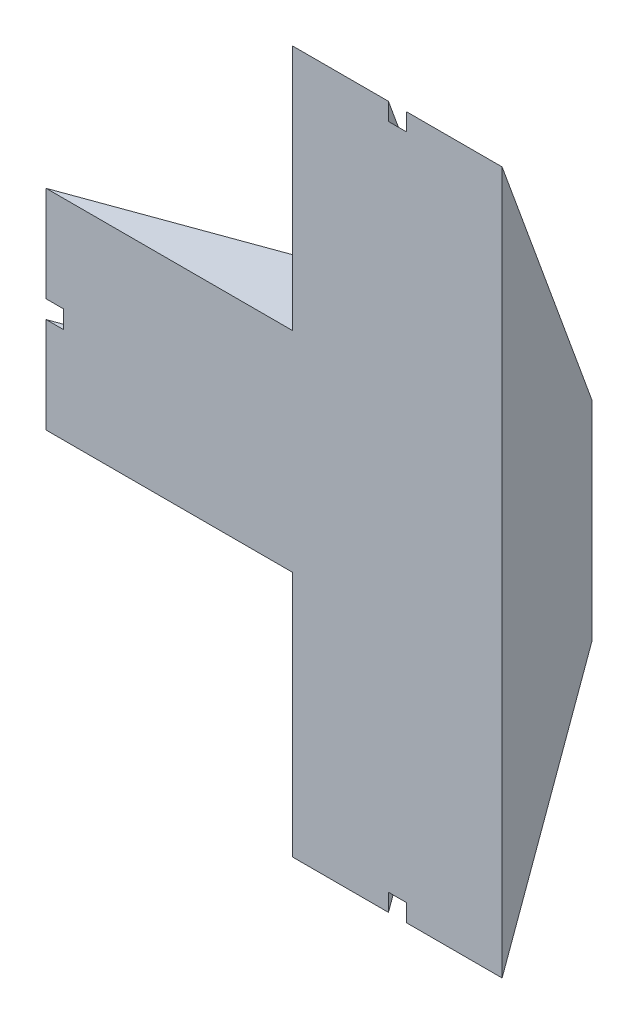
ISO-10303-21;
HEADER;
FILE_DESCRIPTION(('STEP AP214'),'2;1');
FILE_NAME('part.step','',(''),(''),'','','');
FILE_SCHEMA(('AUTOMOTIVE_DESIGN { 1 0 10303 214 1 1 1 1 }'));
ENDSEC;
DATA;
#1=APPLICATION_CONTEXT('core data for automotive mechanical design processes');
#2=APPLICATION_PROTOCOL_DEFINITION('international standard','automotive_design',2000,#1);
#3=PRODUCT_CONTEXT('',#1,'mechanical');
#4=PRODUCT('Part','Part','',(#3));
#5=PRODUCT_RELATED_PRODUCT_CATEGORY('part','',(#4));
#6=PRODUCT_DEFINITION_FORMATION('','',#4);
#7=PRODUCT_DEFINITION_CONTEXT('part definition',#1,'design');
#8=PRODUCT_DEFINITION('design','',#6,#7);
#9=PRODUCT_DEFINITION_SHAPE('','',#8);
#10=(LENGTH_UNIT() NAMED_UNIT(*) SI_UNIT(.MILLI.,.METRE.));
#11=(NAMED_UNIT(*) PLANE_ANGLE_UNIT() SI_UNIT($,.RADIAN.));
#12=(NAMED_UNIT(*) SI_UNIT($,.STERADIAN.) SOLID_ANGLE_UNIT());
#13=UNCERTAINTY_MEASURE_WITH_UNIT(LENGTH_MEASURE(1.E-05),#10,'distance_accuracy_value','');
#14=(GEOMETRIC_REPRESENTATION_CONTEXT(3) GLOBAL_UNCERTAINTY_ASSIGNED_CONTEXT((#13)) GLOBAL_UNIT_ASSIGNED_CONTEXT((#10,
#11,#12)) REPRESENTATION_CONTEXT('',''));
#15=CARTESIAN_POINT('',(0.,0.,0.));
#16=DIRECTION('',(0.,0.,1.));
#17=DIRECTION('',(1.,0.,0.));
#18=AXIS2_PLACEMENT_3D('',#15,#16,#17);
#19=CARTESIAN_POINT('',(412.121612918201,89.1512931806673,-244.941164929067));
#20=DIRECTION('',(0.,-0.342020143325663,0.93969262078591));
#21=DIRECTION('',(0.,-0.939692620785911,-0.342020143325663));
#22=AXIS2_PLACEMENT_3D('',#19,#20,#21);
#23=PLANE('',#22);
#24=DIRECTION('',(-1.,0.,0.));
#25=VECTOR('',#24,1.);
#26=CARTESIAN_POINT('',(762.121612918201,350.,-150.));
#27=LINE('',#26,#25);
#28=CARTESIAN_POINT('',(762.121612918201,350.,-150.));
#29=VERTEX_POINT('',#28);
#30=CARTESIAN_POINT('',(602.121612918201,350.,-150.));
#31=VERTEX_POINT('',#30);
#32=EDGE_CURVE('E210',#29,#31,#27,.T.);
#33=ORIENTED_EDGE('',*,*,#32,.T.);
#34=DIRECTION('',(0.,-0.93969262078591,-0.342020143325663));
#35=VECTOR('',#34,1.);
#36=CARTESIAN_POINT('',(602.121612918201,350.,-150.));
#37=LINE('',#36,#35);
#38=CARTESIAN_POINT('',(602.121612918201,762.121612918201,0.));
#39=VERTEX_POINT('',#38);
#40=EDGE_CURVE('E192',#39,#31,#37,.T.);
#41=ORIENTED_EDGE('',*,*,#40,.F.);
#42=DIRECTION('',(1.,0.,0.));
#43=VECTOR('',#42,1.);
#44=CARTESIAN_POINT('',(412.121612918201,762.121612918201,0.));
#45=LINE('',#44,#43);
#46=CARTESIAN_POINT('',(762.121612918201,762.121612918201,0.));
#47=VERTEX_POINT('',#46);
#48=EDGE_CURVE('E279',#39,#47,#45,.T.);
#49=ORIENTED_EDGE('',*,*,#48,.T.);
#50=DIRECTION('',(0.,-0.939692620785911,-0.342020143325663));
#51=VECTOR('',#50,1.);
#52=CARTESIAN_POINT('',(762.121612918201,89.1512931806673,-244.941164929067));
#53=LINE('',#52,#51);
#54=EDGE_CURVE('E271',#47,#29,#53,.T.);
#55=ORIENTED_EDGE('',*,*,#54,.T.);
#56=EDGE_LOOP('',(#33,#41,#49,#55));
#57=FACE_BOUND('',#56,.T.);
#58=ADVANCED_FACE('F35',(#57),#23,.F.);
#59=CARTESIAN_POINT('',(0.,0.,-140.));
#60=DIRECTION('',(0.,0.,-1.));
#61=DIRECTION('',(-1.,0.,0.));
#62=AXIS2_PLACEMENT_3D('',#59,#60,#61);
#63=PLANE('',#62);
#64=DIRECTION('',(0.,1.,0.));
#65=VECTOR('',#64,1.);
#66=CARTESIAN_POINT('',(572.121612918201,190.,-140.));
#67=LINE('',#66,#65);
#68=CARTESIAN_POINT('',(572.121612918201,190.,-140.));
#69=VERTEX_POINT('',#68);
#70=CARTESIAN_POINT('',(572.121612918201,348.236730192916,-140.));
#71=VERTEX_POINT('',#70);
#72=EDGE_CURVE('E329',#69,#71,#67,.T.);
#73=ORIENTED_EDGE('',*,*,#72,.T.);
#74=DIRECTION('',(1.,0.,0.));
#75=VECTOR('',#74,1.);
#76=CARTESIAN_POINT('',(0.,348.236730192916,-140.));
#77=LINE('',#76,#75);
#78=CARTESIAN_POINT('',(602.121612918201,348.236730192916,-140.));
#79=VERTEX_POINT('',#78);
#80=EDGE_CURVE('E394',#71,#79,#77,.T.);
#81=ORIENTED_EDGE('',*,*,#80,.T.);
#82=DIRECTION('',(0.,-1.,0.));
#83=VECTOR('',#82,1.);
#84=CARTESIAN_POINT('',(602.121612918201,190.,-140.));
#85=LINE('',#84,#83);
#86=CARTESIAN_POINT('',(602.121612918201,1.76326980708429,-140.));
#87=VERTEX_POINT('',#86);
#88=EDGE_CURVE('E333',#79,#87,#85,.T.);
#89=ORIENTED_EDGE('',*,*,#88,.T.);
#90=DIRECTION('',(1.,0.,0.));
#91=VECTOR('',#90,1.);
#92=CARTESIAN_POINT('',(0.,1.76326980708428,-140.));
#93=LINE('',#92,#91);
#94=CARTESIAN_POINT('',(572.121612918201,1.76326980708429,-140.));
#95=VERTEX_POINT('',#94);
#96=EDGE_CURVE('E313',#95,#87,#93,.T.);
#97=ORIENTED_EDGE('',*,*,#96,.F.);
#98=DIRECTION('',(0.,1.,0.));
#99=VECTOR('',#98,1.);
#100=CARTESIAN_POINT('',(572.121612918201,160.,-140.));
#101=LINE('',#100,#99);
#102=CARTESIAN_POINT('',(572.121612918201,160.,-140.));
#103=VERTEX_POINT('',#102);
#104=EDGE_CURVE('E335',#95,#103,#101,.T.);
#105=ORIENTED_EDGE('',*,*,#104,.T.);
#106=DIRECTION('',(-1.,0.,0.));
#107=VECTOR('',#106,1.);
#108=CARTESIAN_POINT('',(412.121612918201,160.,-140.));
#109=LINE('',#108,#107);
#110=CARTESIAN_POINT('',(413.884882725286,160.,-140.));
#111=VERTEX_POINT('',#110);
#112=EDGE_CURVE('E337',#103,#111,#109,.T.);
#113=ORIENTED_EDGE('',*,*,#112,.T.);
#114=DIRECTION('',(0.,1.,0.));
#115=VECTOR('',#114,1.);
#116=CARTESIAN_POINT('',(413.884882725286,0.,-140.));
#117=LINE('',#116,#115);
#118=CARTESIAN_POINT('',(413.884882725286,190.,-140.));
#119=VERTEX_POINT('',#118);
#120=EDGE_CURVE('E246',#111,#119,#117,.T.);
#121=ORIENTED_EDGE('',*,*,#120,.T.);
#122=DIRECTION('',(1.,0.,0.));
#123=VECTOR('',#122,1.);
#124=CARTESIAN_POINT('',(412.121612918201,190.,-140.));
#125=LINE('',#124,#123);
#126=EDGE_CURVE('E327',#119,#69,#125,.T.);
#127=ORIENTED_EDGE('',*,*,#126,.T.);
#128=EDGE_LOOP('',(#73,#81,#89,#97,#105,#113,#121,#127));
#129=FACE_BOUND('',#128,.T.);
#130=ADVANCED_FACE('F380',(#129),#63,.T.);
#131=CARTESIAN_POINT('',(412.121612918201,-412.121612918201,0.));
#132=DIRECTION('',(0.,-0.342020143325663,-0.939692620785911));
#133=DIRECTION('',(0.,0.939692620785911,-0.342020143325663));
#134=AXIS2_PLACEMENT_3D('',#131,#132,#133);
#135=PLANE('',#134);
#136=DIRECTION('',(0.,0.939692620785911,-0.342020143325663));
#137=VECTOR('',#136,1.);
#138=CARTESIAN_POINT('',(572.121612918201,0.,-150.));
#139=LINE('',#138,#137);
#140=CARTESIAN_POINT('',(572.121612918201,-412.121612918201,0.));
#141=VERTEX_POINT('',#140);
#142=CARTESIAN_POINT('',(572.121612918201,0.,-150.));
#143=VERTEX_POINT('',#142);
#144=EDGE_CURVE('E304',#141,#143,#139,.T.);
#145=ORIENTED_EDGE('',*,*,#144,.F.);
#146=DIRECTION('',(1.,0.,0.));
#147=VECTOR('',#146,1.);
#148=CARTESIAN_POINT('',(412.121612918201,-412.121612918201,0.));
#149=LINE('',#148,#147);
#150=CARTESIAN_POINT('',(412.121612918201,-412.121612918201,0.));
#151=VERTEX_POINT('',#150);
#152=EDGE_CURVE('E268',#151,#141,#149,.T.);
#153=ORIENTED_EDGE('',*,*,#152,.F.);
#154=DIRECTION('',(0.,0.939692620785911,-0.342020143325663));
#155=VECTOR('',#154,1.);
#156=CARTESIAN_POINT('',(412.121612918201,-412.121612918201,0.));
#157=LINE('',#156,#155);
#158=CARTESIAN_POINT('',(412.121612918201,0.,-150.));
#159=VERTEX_POINT('',#158);
#160=EDGE_CURVE('E263',#151,#159,#157,.T.);
#161=ORIENTED_EDGE('',*,*,#160,.T.);
#162=DIRECTION('',(-1.,0.,0.));
#163=VECTOR('',#162,1.);
#164=CARTESIAN_POINT('',(762.121612918201,0.,-150.));
#165=LINE('',#164,#163);
#166=EDGE_CURVE('E213',#143,#159,#165,.T.);
#167=ORIENTED_EDGE('',*,*,#166,.F.);
#168=EDGE_LOOP('',(#145,#153,#161,#167));
#169=FACE_BOUND('',#168,.T.);
#170=ADVANCED_FACE('F368',(#169),#135,.T.);
#171=CARTESIAN_POINT('',(762.121612918201,0.,-150.));
#172=DIRECTION('',(0.,0.,1.));
#173=DIRECTION('',(1.,0.,0.));
#174=AXIS2_PLACEMENT_3D('',#171,#172,#173);
#175=PLANE('',#174);
#176=DIRECTION('',(0.,-1.,0.));
#177=VECTOR('',#176,1.);
#178=CARTESIAN_POINT('',(412.121612918201,350.,-150.));
#179=LINE('',#178,#177);
#180=CARTESIAN_POINT('',(412.121612918201,160.,-150.));
#181=VERTEX_POINT('',#180);
#182=EDGE_CURVE('E228',#181,#159,#179,.T.);
#183=ORIENTED_EDGE('',*,*,#182,.F.);
#184=DIRECTION('',(-1.,0.,0.));
#185=VECTOR('',#184,1.);
#186=CARTESIAN_POINT('',(412.121612918201,160.,-150.));
#187=LINE('',#186,#185);
#188=CARTESIAN_POINT('',(572.121612918201,160.,-150.));
#189=VERTEX_POINT('',#188);
#190=EDGE_CURVE('E330',#189,#181,#187,.T.);
#191=ORIENTED_EDGE('',*,*,#190,.F.);
#192=DIRECTION('',(0.,1.,0.));
#193=VECTOR('',#192,1.);
#194=CARTESIAN_POINT('',(572.121612918201,160.,-150.));
#195=LINE('',#194,#193);
#196=EDGE_CURVE('E341',#143,#189,#195,.T.);
#197=ORIENTED_EDGE('',*,*,#196,.F.);
#198=ORIENTED_EDGE('',*,*,#166,.T.);
#199=EDGE_LOOP('',(#183,#191,#197,#198));
#200=FACE_BOUND('',#199,.T.);
#201=ADVANCED_FACE('F377',(#200),#175,.F.);
#202=CARTESIAN_POINT('',(762.121612918201,0.,-150.));
#203=VERTEX_POINT('',#202);
#204=CARTESIAN_POINT('',(602.121612918201,0.,-150.));
#205=VERTEX_POINT('',#204);
#206=EDGE_CURVE('E218',#203,#205,#165,.T.);
#207=ORIENTED_EDGE('',*,*,#206,.T.);
#208=DIRECTION('',(0.,-1.,0.));
#209=VECTOR('',#208,1.);
#210=CARTESIAN_POINT('',(602.121612918201,160.,-150.));
#211=LINE('',#210,#209);
#212=EDGE_CURVE('E202',#31,#205,#211,.T.);
#213=ORIENTED_EDGE('',*,*,#212,.F.);
#214=ORIENTED_EDGE('',*,*,#32,.F.);
#215=DIRECTION('',(0.,1.,0.));
#216=VECTOR('',#215,1.);
#217=CARTESIAN_POINT('',(762.121612918201,0.,-150.));
#218=LINE('',#217,#216);
#219=EDGE_CURVE('E79',#203,#29,#218,.T.);
#220=ORIENTED_EDGE('',*,*,#219,.F.);
#221=EDGE_LOOP('',(#207,#213,#214,#220));
#222=FACE_BOUND('',#221,.T.);
#223=ADVANCED_FACE('F293',(#222),#175,.F.);
#224=CARTESIAN_POINT('',(3.42020143325663,0.,9.3969262078591));
#225=DIRECTION('',(0.342020143325663,0.,0.93969262078591));
#226=DIRECTION('',(0.93969262078591,0.,-0.342020143325663));
#227=AXIS2_PLACEMENT_3D('',#224,#225,#226);
#228=PLANE('',#227);
#229=ORIENTED_EDGE('',*,*,#120,.F.);
#230=DIRECTION('',(-0.93969262078591,0.,0.342020143325663));
#231=VECTOR('',#230,1.);
#232=CARTESIAN_POINT('',(3.42020143325661,160.,9.39692620785911));
#233=LINE('',#232,#231);
#234=CARTESIAN_POINT('',(29.2380440016314,160.,0.));
#235=VERTEX_POINT('',#234);
#236=EDGE_CURVE('E253',#111,#235,#233,.T.);
#237=ORIENTED_EDGE('',*,*,#236,.T.);
#238=DIRECTION('',(0.,-1.,0.));
#239=VECTOR('',#238,1.);
#240=CARTESIAN_POINT('',(29.2380440016314,350.,0.));
#241=LINE('',#240,#239);
#242=CARTESIAN_POINT('',(29.2380440016314,190.,0.));
#243=VERTEX_POINT('',#242);
#244=EDGE_CURVE('E11',#243,#235,#241,.T.);
#245=ORIENTED_EDGE('',*,*,#244,.F.);
#246=DIRECTION('',(0.93969262078591,0.,-0.342020143325663));
#247=VECTOR('',#246,1.);
#248=CARTESIAN_POINT('',(3.42020143325661,190.,9.39692620785911));
#249=LINE('',#248,#247);
#250=EDGE_CURVE('E248',#243,#119,#249,.T.);
#251=ORIENTED_EDGE('',*,*,#250,.T.);
#252=EDGE_LOOP('',(#229,#237,#245,#251));
#253=FACE_BOUND('',#252,.T.);
#254=ADVANCED_FACE('F352',(#253),#228,.F.);
#255=CARTESIAN_POINT('',(412.121612918201,350.,-150.));
#256=DIRECTION('',(0.342020143325663,0.,0.93969262078591));
#257=DIRECTION('',(0.93969262078591,0.,-0.342020143325663));
#258=AXIS2_PLACEMENT_3D('',#255,#256,#257);
#259=PLANE('',#258);
#260=DIRECTION('',(0.,-1.,0.));
#261=VECTOR('',#260,1.);
#262=CARTESIAN_POINT('',(0.,350.,0.));
#263=LINE('',#262,#261);
#264=CARTESIAN_POINT('',(0.,160.,0.));
#265=VERTEX_POINT('',#264);
#266=CARTESIAN_POINT('',(0.,0.,0.));
#267=VERTEX_POINT('',#266);
#268=EDGE_CURVE('E71',#265,#267,#263,.T.);
#269=ORIENTED_EDGE('',*,*,#268,.F.);
#270=DIRECTION('',(-0.93969262078591,0.,0.342020143325663));
#271=VECTOR('',#270,1.);
#272=CARTESIAN_POINT('',(0.,160.,0.));
#273=LINE('',#272,#271);
#274=EDGE_CURVE('E245',#181,#265,#273,.T.);
#275=ORIENTED_EDGE('',*,*,#274,.F.);
#276=ORIENTED_EDGE('',*,*,#182,.T.);
#277=DIRECTION('',(-0.93969262078591,0.,0.342020143325663));
#278=VECTOR('',#277,1.);
#279=CARTESIAN_POINT('',(412.121612918201,0.,-150.));
#280=LINE('',#279,#278);
#281=EDGE_CURVE('E221',#159,#267,#280,.T.);
#282=ORIENTED_EDGE('',*,*,#281,.T.);
#283=EDGE_LOOP('',(#269,#275,#276,#282));
#284=FACE_BOUND('',#283,.T.);
#285=ADVANCED_FACE('F358',(#284),#259,.F.);
#286=CARTESIAN_POINT('',(0.,0.,0.));
#287=DIRECTION('',(0.,-1.,0.));
#288=DIRECTION('',(0.,0.,-1.));
#289=AXIS2_PLACEMENT_3D('',#286,#287,#288);
#290=PLANE('',#289);
#291=ORIENTED_EDGE('',*,*,#281,.F.);
#292=DIRECTION('',(0.,0.,1.));
#293=VECTOR('',#292,1.);
#294=CARTESIAN_POINT('',(412.121612918201,0.,0.));
#295=LINE('',#294,#293);
#296=CARTESIAN_POINT('',(412.121612918201,0.,0.));
#297=VERTEX_POINT('',#296);
#298=EDGE_CURVE('E260',#159,#297,#295,.T.);
#299=ORIENTED_EDGE('',*,*,#298,.T.);
#300=DIRECTION('',(1.,0.,0.));
#301=VECTOR('',#300,1.);
#302=CARTESIAN_POINT('',(0.,0.,0.));
#303=LINE('',#302,#301);
#304=EDGE_CURVE('E226',#267,#297,#303,.T.);
#305=ORIENTED_EDGE('',*,*,#304,.F.);
#306=EDGE_LOOP('',(#291,#299,#305));
#307=FACE_BOUND('',#306,.T.);
#308=ADVANCED_FACE('F363',(#307),#290,.T.);
#309=CARTESIAN_POINT('',(0.,350.,0.));
#310=DIRECTION('',(0.,-1.,0.));
#311=DIRECTION('',(0.,0.,-1.));
#312=AXIS2_PLACEMENT_3D('',#309,#310,#311);
#313=PLANE('',#312);
#314=DIRECTION('',(0.,0.,1.));
#315=VECTOR('',#314,1.);
#316=CARTESIAN_POINT('',(412.121612918201,350.,0.));
#317=LINE('',#316,#315);
#318=CARTESIAN_POINT('',(412.121612918201,350.,-150.));
#319=VERTEX_POINT('',#318);
#320=CARTESIAN_POINT('',(412.121612918201,350.,0.));
#321=VERTEX_POINT('',#320);
#322=EDGE_CURVE('E276',#319,#321,#317,.T.);
#323=ORIENTED_EDGE('',*,*,#322,.F.);
#324=DIRECTION('',(-0.93969262078591,0.,0.342020143325663));
#325=VECTOR('',#324,1.);
#326=CARTESIAN_POINT('',(412.121612918201,350.,-150.));
#327=LINE('',#326,#325);
#328=CARTESIAN_POINT('',(0.,350.,0.));
#329=VERTEX_POINT('',#328);
#330=EDGE_CURVE('E222',#319,#329,#327,.T.);
#331=ORIENTED_EDGE('',*,*,#330,.T.);
#332=DIRECTION('',(1.,0.,0.));
#333=VECTOR('',#332,1.);
#334=CARTESIAN_POINT('',(0.,350.,0.));
#335=LINE('',#334,#333);
#336=EDGE_CURVE('E225',#329,#321,#335,.T.);
#337=ORIENTED_EDGE('',*,*,#336,.T.);
#338=EDGE_LOOP('',(#323,#331,#337));
#339=FACE_BOUND('',#338,.T.);
#340=ADVANCED_FACE('F429',(#339),#313,.F.);
#341=CARTESIAN_POINT('',(412.121612918201,190.,-150.));
#342=VERTEX_POINT('',#341);
#343=EDGE_CURVE('E208',#319,#342,#179,.T.);
#344=ORIENTED_EDGE('',*,*,#343,.T.);
#345=DIRECTION('',(0.93969262078591,0.,-0.342020143325663));
#346=VECTOR('',#345,1.);
#347=CARTESIAN_POINT('',(0.,190.,0.));
#348=LINE('',#347,#346);
#349=CARTESIAN_POINT('',(0.,190.,0.));
#350=VERTEX_POINT('',#349);
#351=EDGE_CURVE('E243',#350,#342,#348,.T.);
#352=ORIENTED_EDGE('',*,*,#351,.F.);
#353=EDGE_CURVE('E43',#329,#350,#263,.T.);
#354=ORIENTED_EDGE('',*,*,#353,.F.);
#355=ORIENTED_EDGE('',*,*,#330,.F.);
#356=EDGE_LOOP('',(#344,#352,#354,#355));
#357=FACE_BOUND('',#356,.T.);
#358=ADVANCED_FACE('F37',(#357),#259,.F.);
#359=CARTESIAN_POINT('',(0.,350.,0.));
#360=DIRECTION('',(0.,0.,-1.));
#361=DIRECTION('',(-1.,0.,0.));
#362=AXIS2_PLACEMENT_3D('',#359,#360,#361);
#363=PLANE('',#362);
#364=ORIENTED_EDGE('',*,*,#48,.F.);
#365=DIRECTION('',(0.,-1.,0.));
#366=VECTOR('',#365,1.);
#367=CARTESIAN_POINT('',(602.121612918201,350.,0.));
#368=LINE('',#367,#366);
#369=CARTESIAN_POINT('',(602.121612918201,732.88356891657,0.));
#370=VERTEX_POINT('',#369);
#371=EDGE_CURVE('E298',#39,#370,#368,.T.);
#372=ORIENTED_EDGE('',*,*,#371,.T.);
#373=DIRECTION('',(1.,0.,0.));
#374=VECTOR('',#373,1.);
#375=CARTESIAN_POINT('',(0.,732.88356891657,0.));
#376=LINE('',#375,#374);
#377=CARTESIAN_POINT('',(572.121612918201,732.88356891657,0.));
#378=VERTEX_POINT('',#377);
#379=EDGE_CURVE('E299',#378,#370,#376,.T.);
#380=ORIENTED_EDGE('',*,*,#379,.F.);
#381=DIRECTION('',(0.,1.,0.));
#382=VECTOR('',#381,1.);
#383=CARTESIAN_POINT('',(572.121612918201,350.,0.));
#384=LINE('',#383,#382);
#385=CARTESIAN_POINT('',(572.121612918201,762.121612918201,0.));
#386=VERTEX_POINT('',#385);
#387=EDGE_CURVE('E302',#378,#386,#384,.T.);
#388=ORIENTED_EDGE('',*,*,#387,.T.);
#389=CARTESIAN_POINT('',(412.121612918201,762.121612918201,0.));
#390=VERTEX_POINT('',#389);
#391=EDGE_CURVE('E189',#390,#386,#45,.T.);
#392=ORIENTED_EDGE('',*,*,#391,.F.);
#393=DIRECTION('',(0.,1.,0.));
#394=VECTOR('',#393,1.);
#395=CARTESIAN_POINT('',(412.121612918201,0.,0.));
#396=LINE('',#395,#394);
#397=EDGE_CURVE('E274',#321,#390,#396,.T.);
#398=ORIENTED_EDGE('',*,*,#397,.F.);
#399=ORIENTED_EDGE('',*,*,#336,.F.);
#400=ORIENTED_EDGE('',*,*,#353,.T.);
#401=DIRECTION('',(1.,0.,0.));
#402=VECTOR('',#401,1.);
#403=CARTESIAN_POINT('',(0.,190.,0.));
#404=LINE('',#403,#402);
#405=EDGE_CURVE('E237',#350,#243,#404,.T.);
#406=ORIENTED_EDGE('',*,*,#405,.T.);
#407=ORIENTED_EDGE('',*,*,#244,.T.);
#408=DIRECTION('',(-1.,0.,0.));
#409=VECTOR('',#408,1.);
#410=CARTESIAN_POINT('',(0.,160.,0.));
#411=LINE('',#410,#409);
#412=EDGE_CURVE('E257',#235,#265,#411,.T.);
#413=ORIENTED_EDGE('',*,*,#412,.T.);
#414=ORIENTED_EDGE('',*,*,#268,.T.);
#415=ORIENTED_EDGE('',*,*,#304,.T.);
#416=DIRECTION('',(0.,-1.,0.));
#417=VECTOR('',#416,1.);
#418=CARTESIAN_POINT('',(412.121612918201,0.,0.));
#419=LINE('',#418,#417);
#420=EDGE_CURVE('E50',#297,#151,#419,.T.);
#421=ORIENTED_EDGE('',*,*,#420,.T.);
#422=ORIENTED_EDGE('',*,*,#152,.T.);
#423=DIRECTION('',(0.,1.,0.));
#424=VECTOR('',#423,1.);
#425=CARTESIAN_POINT('',(572.121612918201,350.,0.));
#426=LINE('',#425,#424);
#427=CARTESIAN_POINT('',(572.121612918201,-382.88356891657,0.));
#428=VERTEX_POINT('',#427);
#429=EDGE_CURVE('E324',#141,#428,#426,.T.);
#430=ORIENTED_EDGE('',*,*,#429,.T.);
#431=DIRECTION('',(1.,0.,0.));
#432=VECTOR('',#431,1.);
#433=CARTESIAN_POINT('',(0.,-382.88356891657,0.));
#434=LINE('',#433,#432);
#435=CARTESIAN_POINT('',(602.121612918201,-382.88356891657,0.));
#436=VERTEX_POINT('',#435);
#437=EDGE_CURVE('E318',#428,#436,#434,.T.);
#438=ORIENTED_EDGE('',*,*,#437,.T.);
#439=DIRECTION('',(0.,-1.,0.));
#440=VECTOR('',#439,1.);
#441=CARTESIAN_POINT('',(602.121612918201,350.,0.));
#442=LINE('',#441,#440);
#443=CARTESIAN_POINT('',(602.121612918201,-412.121612918201,0.));
#444=VERTEX_POINT('',#443);
#445=EDGE_CURVE('E321',#436,#444,#442,.T.);
#446=ORIENTED_EDGE('',*,*,#445,.T.);
#447=CARTESIAN_POINT('',(762.121612918201,-412.121612918201,0.));
#448=VERTEX_POINT('',#447);
#449=EDGE_CURVE('E266',#444,#448,#149,.T.);
#450=ORIENTED_EDGE('',*,*,#449,.T.);
#451=DIRECTION('',(0.,-1.,0.));
#452=VECTOR('',#451,1.);
#453=CARTESIAN_POINT('',(762.121612918201,350.,0.));
#454=LINE('',#453,#452);
#455=EDGE_CURVE('E214',#47,#448,#454,.T.);
#456=ORIENTED_EDGE('',*,*,#455,.F.);
#457=EDGE_LOOP('',(#364,#372,#380,#388,#392,#398,#399,#400,#406,#407,#413,#414,#415,#421,#422,
#430,#438,#446,#450,#456));
#458=FACE_BOUND('',#457,.T.);
#459=ADVANCED_FACE('F236',(#458),#363,.F.);
#460=CARTESIAN_POINT('',(572.121612918201,350.,-150.));
#461=VERTEX_POINT('',#460);
#462=EDGE_CURVE('E59',#461,#319,#27,.T.);
#463=ORIENTED_EDGE('',*,*,#462,.F.);
#464=DIRECTION('',(0.,1.,0.));
#465=VECTOR('',#464,1.);
#466=CARTESIAN_POINT('',(572.121612918201,190.,-150.));
#467=LINE('',#466,#465);
#468=CARTESIAN_POINT('',(572.121612918201,190.,-150.));
#469=VERTEX_POINT('',#468);
#470=EDGE_CURVE('E195',#469,#461,#467,.T.);
#471=ORIENTED_EDGE('',*,*,#470,.F.);
#472=DIRECTION('',(1.,0.,0.));
#473=VECTOR('',#472,1.);
#474=CARTESIAN_POINT('',(412.121612918201,190.,-150.));
#475=LINE('',#474,#473);
#476=EDGE_CURVE('E203',#342,#469,#475,.T.);
#477=ORIENTED_EDGE('',*,*,#476,.F.);
#478=ORIENTED_EDGE('',*,*,#343,.F.);
#479=EDGE_LOOP('',(#463,#471,#477,#478));
#480=FACE_BOUND('',#479,.T.);
#481=ADVANCED_FACE('F206',(#480),#175,.F.);
#482=CARTESIAN_POINT('',(762.121612918201,0.,0.));
#483=DIRECTION('',(1.,0.,0.));
#484=DIRECTION('',(0.,0.,-1.));
#485=AXIS2_PLACEMENT_3D('',#482,#483,#484);
#486=PLANE('',#485);
#487=ORIENTED_EDGE('',*,*,#455,.T.);
#488=DIRECTION('',(0.,0.939692620785911,-0.342020143325663));
#489=VECTOR('',#488,1.);
#490=CARTESIAN_POINT('',(762.121612918201,-412.121612918201,0.));
#491=LINE('',#490,#489);
#492=EDGE_CURVE('E259',#448,#203,#491,.T.);
#493=ORIENTED_EDGE('',*,*,#492,.T.);
#494=ORIENTED_EDGE('',*,*,#219,.T.);
#495=ORIENTED_EDGE('',*,*,#54,.F.);
#496=EDGE_LOOP('',(#487,#493,#494,#495));
#497=FACE_BOUND('',#496,.T.);
#498=ADVANCED_FACE('F285',(#497),#486,.T.);
#499=ORIENTED_EDGE('',*,*,#391,.T.);
#500=DIRECTION('',(0.,0.93969262078591,0.342020143325663));
#501=VECTOR('',#500,1.);
#502=CARTESIAN_POINT('',(572.121612918201,350.,-150.));
#503=LINE('',#502,#501);
#504=EDGE_CURVE('E185',#461,#386,#503,.T.);
#505=ORIENTED_EDGE('',*,*,#504,.F.);
#506=ORIENTED_EDGE('',*,*,#462,.T.);
#507=DIRECTION('',(0.,-0.939692620785911,-0.342020143325663));
#508=VECTOR('',#507,1.);
#509=CARTESIAN_POINT('',(412.121612918201,89.1512931806673,-244.941164929067));
#510=LINE('',#509,#508);
#511=EDGE_CURVE('E272',#390,#319,#510,.T.);
#512=ORIENTED_EDGE('',*,*,#511,.F.);
#513=EDGE_LOOP('',(#499,#505,#506,#512));
#514=FACE_BOUND('',#513,.T.);
#515=ADVANCED_FACE('F187',(#514),#23,.F.);
#516=CARTESIAN_POINT('',(412.121612918201,0.,0.));
#517=DIRECTION('',(1.,0.,0.));
#518=DIRECTION('',(0.,0.,-1.));
#519=AXIS2_PLACEMENT_3D('',#516,#517,#518);
#520=PLANE('',#519);
#521=ORIENTED_EDGE('',*,*,#511,.T.);
#522=ORIENTED_EDGE('',*,*,#322,.T.);
#523=ORIENTED_EDGE('',*,*,#397,.T.);
#524=EDGE_LOOP('',(#521,#522,#523));
#525=FACE_BOUND('',#524,.T.);
#526=ADVANCED_FACE('F418',(#525),#520,.F.);
#527=DIRECTION('',(0.,-0.939692620785911,0.342020143325663));
#528=VECTOR('',#527,1.);
#529=CARTESIAN_POINT('',(602.121612918201,0.,-150.));
#530=LINE('',#529,#528);
#531=EDGE_CURVE('E289',#205,#444,#530,.T.);
#532=ORIENTED_EDGE('',*,*,#531,.F.);
#533=ORIENTED_EDGE('',*,*,#206,.F.);
#534=ORIENTED_EDGE('',*,*,#492,.F.);
#535=ORIENTED_EDGE('',*,*,#449,.F.);
#536=EDGE_LOOP('',(#532,#533,#534,#535));
#537=FACE_BOUND('',#536,.T.);
#538=ADVANCED_FACE('F288',(#537),#135,.T.);
#539=CARTESIAN_POINT('',(412.121612918201,0.,0.));
#540=DIRECTION('',(-1.,0.,0.));
#541=DIRECTION('',(0.,0.,1.));
#542=AXIS2_PLACEMENT_3D('',#539,#540,#541);
#543=PLANE('',#542);
#544=ORIENTED_EDGE('',*,*,#298,.F.);
#545=ORIENTED_EDGE('',*,*,#160,.F.);
#546=ORIENTED_EDGE('',*,*,#420,.F.);
#547=EDGE_LOOP('',(#544,#545,#546));
#548=FACE_BOUND('',#547,.T.);
#549=ADVANCED_FACE('F364',(#548),#543,.T.);
#550=CARTESIAN_POINT('',(3.42020143325661,160.,9.39692620785911));
#551=DIRECTION('',(0.,-1.,0.));
#552=DIRECTION('',(1.,0.,0.));
#553=AXIS2_PLACEMENT_3D('',#550,#551,#552);
#554=PLANE('',#553);
#555=ORIENTED_EDGE('',*,*,#236,.F.);
#556=ORIENTED_EDGE('',*,*,#112,.F.);
#557=DIRECTION('',(0.,0.,-1.));
#558=VECTOR('',#557,1.);
#559=CARTESIAN_POINT('',(572.121612918201,160.,-140.));
#560=LINE('',#559,#558);
#561=EDGE_CURVE('E250',#103,#189,#560,.T.);
#562=ORIENTED_EDGE('',*,*,#561,.T.);
#563=ORIENTED_EDGE('',*,*,#190,.T.);
#564=ORIENTED_EDGE('',*,*,#274,.T.);
#565=ORIENTED_EDGE('',*,*,#412,.F.);
#566=EDGE_LOOP('',(#555,#556,#562,#563,#564,#565));
#567=FACE_BOUND('',#566,.T.);
#568=ADVANCED_FACE('F355',(#567),#554,.F.);
#569=CARTESIAN_POINT('',(3.42020143325661,190.,9.39692620785911));
#570=DIRECTION('',(0.,1.,0.));
#571=DIRECTION('',(-1.,0.,0.));
#572=AXIS2_PLACEMENT_3D('',#569,#570,#571);
#573=PLANE('',#572);
#574=ORIENTED_EDGE('',*,*,#126,.F.);
#575=ORIENTED_EDGE('',*,*,#250,.F.);
#576=ORIENTED_EDGE('',*,*,#405,.F.);
#577=ORIENTED_EDGE('',*,*,#351,.T.);
#578=ORIENTED_EDGE('',*,*,#476,.T.);
#579=DIRECTION('',(0.,0.,-1.));
#580=VECTOR('',#579,1.);
#581=CARTESIAN_POINT('',(572.121612918201,190.,-140.));
#582=LINE('',#581,#580);
#583=EDGE_CURVE('E199',#69,#469,#582,.T.);
#584=ORIENTED_EDGE('',*,*,#583,.F.);
#585=EDGE_LOOP('',(#574,#575,#576,#577,#578,#584));
#586=FACE_BOUND('',#585,.T.);
#587=ADVANCED_FACE('F399',(#586),#573,.F.);
#588=CARTESIAN_POINT('',(572.121612918201,160.,-140.));
#589=DIRECTION('',(-1.,0.,0.));
#590=DIRECTION('',(0.,0.,1.));
#591=AXIS2_PLACEMENT_3D('',#588,#589,#590);
#592=PLANE('',#591);
#593=ORIENTED_EDGE('',*,*,#104,.F.);
#594=DIRECTION('',(0.,0.939692620785911,-0.342020143325663));
#595=VECTOR('',#594,1.);
#596=CARTESIAN_POINT('',(572.121612918201,3.42020143325661,-140.603073792141));
#597=LINE('',#596,#595);
#598=EDGE_CURVE('E312',#428,#95,#597,.T.);
#599=ORIENTED_EDGE('',*,*,#598,.F.);
#600=ORIENTED_EDGE('',*,*,#429,.F.);
#601=ORIENTED_EDGE('',*,*,#144,.T.);
#602=ORIENTED_EDGE('',*,*,#196,.T.);
#603=ORIENTED_EDGE('',*,*,#561,.F.);
#604=EDGE_LOOP('',(#593,#599,#600,#601,#602,#603));
#605=FACE_BOUND('',#604,.T.);
#606=ADVANCED_FACE('F372',(#605),#592,.F.);
#607=CARTESIAN_POINT('',(602.121612918201,160.,-140.));
#608=DIRECTION('',(1.,0.,0.));
#609=DIRECTION('',(0.,0.,-1.));
#610=AXIS2_PLACEMENT_3D('',#607,#608,#609);
#611=PLANE('',#610);
#612=ORIENTED_EDGE('',*,*,#88,.F.);
#613=DIRECTION('',(0.,-0.93969262078591,-0.342020143325663));
#614=VECTOR('',#613,1.);
#615=CARTESIAN_POINT('',(602.121612918201,346.579798566743,-140.603073792141));
#616=LINE('',#615,#614);
#617=EDGE_CURVE('E390',#370,#79,#616,.T.);
#618=ORIENTED_EDGE('',*,*,#617,.F.);
#619=ORIENTED_EDGE('',*,*,#371,.F.);
#620=ORIENTED_EDGE('',*,*,#40,.T.);
#621=ORIENTED_EDGE('',*,*,#212,.T.);
#622=ORIENTED_EDGE('',*,*,#531,.T.);
#623=ORIENTED_EDGE('',*,*,#445,.F.);
#624=DIRECTION('',(0.,-0.939692620785911,0.342020143325663));
#625=VECTOR('',#624,1.);
#626=CARTESIAN_POINT('',(602.121612918201,3.42020143325661,-140.603073792141));
#627=LINE('',#626,#625);
#628=EDGE_CURVE('E309',#87,#436,#627,.T.);
#629=ORIENTED_EDGE('',*,*,#628,.F.);
#630=EDGE_LOOP('',(#612,#618,#619,#620,#621,#622,#623,#629));
#631=FACE_BOUND('',#630,.T.);
#632=ADVANCED_FACE('F386',(#631),#611,.F.);
#633=CARTESIAN_POINT('',(572.121612918201,190.,-140.));
#634=DIRECTION('',(-1.,0.,0.));
#635=DIRECTION('',(0.,0.,1.));
#636=AXIS2_PLACEMENT_3D('',#633,#634,#635);
#637=PLANE('',#636);
#638=ORIENTED_EDGE('',*,*,#470,.T.);
#639=ORIENTED_EDGE('',*,*,#504,.T.);
#640=ORIENTED_EDGE('',*,*,#387,.F.);
#641=DIRECTION('',(0.,0.93969262078591,0.342020143325663));
#642=VECTOR('',#641,1.);
#643=CARTESIAN_POINT('',(572.121612918201,346.579798566743,-140.603073792141));
#644=LINE('',#643,#642);
#645=EDGE_CURVE('E387',#71,#378,#644,.T.);
#646=ORIENTED_EDGE('',*,*,#645,.F.);
#647=ORIENTED_EDGE('',*,*,#72,.F.);
#648=ORIENTED_EDGE('',*,*,#583,.T.);
#649=EDGE_LOOP('',(#638,#639,#640,#646,#647,#648));
#650=FACE_BOUND('',#649,.T.);
#651=ADVANCED_FACE('F196',(#650),#637,.F.);
#652=CARTESIAN_POINT('',(0.,-44.7888692932331,-123.056407026065));
#653=DIRECTION('',(0.,0.342020143325663,0.939692620785911));
#654=DIRECTION('',(0.,-0.939692620785911,0.342020143325663));
#655=AXIS2_PLACEMENT_3D('',#652,#653,#654);
#656=PLANE('',#655);
#657=ORIENTED_EDGE('',*,*,#598,.T.);
#658=ORIENTED_EDGE('',*,*,#96,.T.);
#659=ORIENTED_EDGE('',*,*,#628,.T.);
#660=ORIENTED_EDGE('',*,*,#437,.F.);
#661=EDGE_LOOP('',(#657,#658,#659,#660));
#662=FACE_BOUND('',#661,.T.);
#663=ADVANCED_FACE('F385',(#662),#656,.F.);
#664=CARTESIAN_POINT('',(0.,85.7310917474106,-235.544238721208));
#665=DIRECTION('',(0.,0.342020143325663,-0.939692620785911));
#666=DIRECTION('',(0.,0.93969262078591,0.342020143325663));
#667=AXIS2_PLACEMENT_3D('',#664,#665,#666);
#668=PLANE('',#667);
#669=ORIENTED_EDGE('',*,*,#379,.T.);
#670=ORIENTED_EDGE('',*,*,#617,.T.);
#671=ORIENTED_EDGE('',*,*,#80,.F.);
#672=ORIENTED_EDGE('',*,*,#645,.T.);
#673=EDGE_LOOP('',(#669,#670,#671,#672));
#674=FACE_BOUND('',#673,.T.);
#675=ADVANCED_FACE('F396',(#674),#668,.T.);
#676=CLOSED_SHELL('',(#58,#130,#170,#201,#223,#254,#285,#308,#340,#358,#459,#481,#498,#515,#526,
#538,#549,#568,#587,#606,#632,#651,#663,#675));
#677=MANIFOLD_SOLID_BREP('B2',#676);
#678=ADVANCED_BREP_SHAPE_REPRESENTATION('',(#18,#677),#14);
#679=SHAPE_DEFINITION_REPRESENTATION(#9,#678);
ENDSEC;
END-ISO-10303-21;
